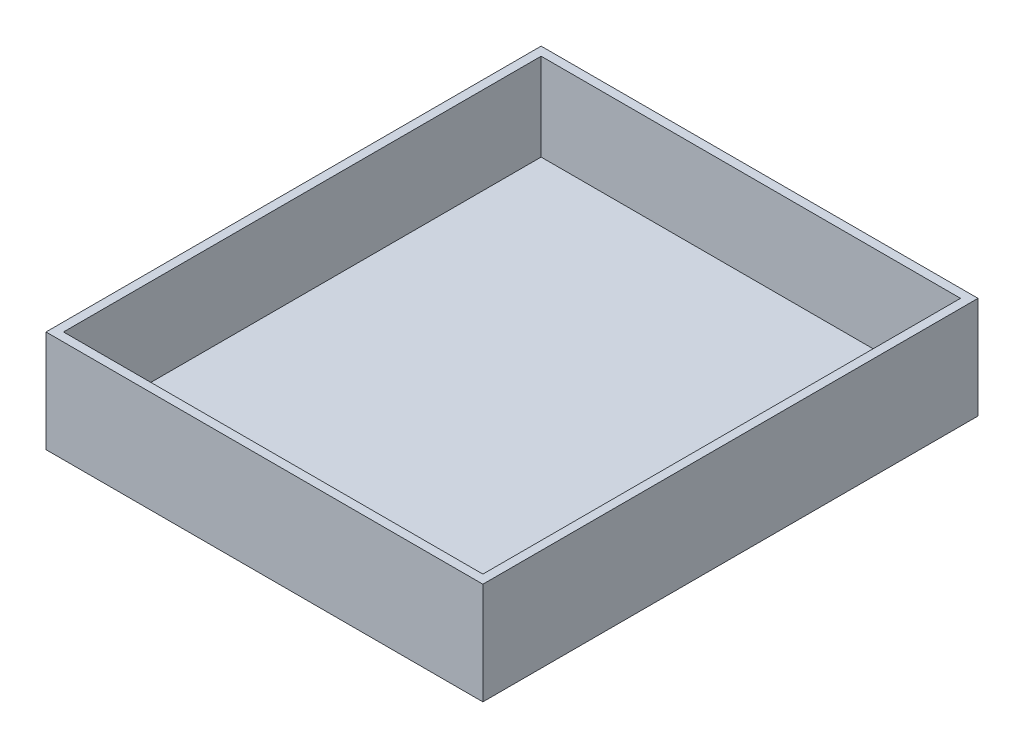
ISO-10303-21;
HEADER;
FILE_DESCRIPTION(('STEP AP214'),'2;1');
FILE_NAME('part.step','',(''),(''),'','','');
FILE_SCHEMA(('AUTOMOTIVE_DESIGN { 1 0 10303 214 1 1 1 1 }'));
ENDSEC;
DATA;
#1=APPLICATION_CONTEXT('core data for automotive mechanical design processes');
#2=APPLICATION_PROTOCOL_DEFINITION('international standard','automotive_design',2000,#1);
#3=PRODUCT_CONTEXT('',#1,'mechanical');
#4=PRODUCT('Part','Part','',(#3));
#5=PRODUCT_RELATED_PRODUCT_CATEGORY('part','',(#4));
#6=PRODUCT_DEFINITION_FORMATION('','',#4);
#7=PRODUCT_DEFINITION_CONTEXT('part definition',#1,'design');
#8=PRODUCT_DEFINITION('design','',#6,#7);
#9=PRODUCT_DEFINITION_SHAPE('','',#8);
#10=(LENGTH_UNIT() NAMED_UNIT(*) SI_UNIT(.MILLI.,.METRE.));
#11=(NAMED_UNIT(*) PLANE_ANGLE_UNIT() SI_UNIT($,.RADIAN.));
#12=(NAMED_UNIT(*) SI_UNIT($,.STERADIAN.) SOLID_ANGLE_UNIT());
#13=UNCERTAINTY_MEASURE_WITH_UNIT(LENGTH_MEASURE(1.E-05),#10,'distance_accuracy_value','');
#14=(GEOMETRIC_REPRESENTATION_CONTEXT(3) GLOBAL_UNCERTAINTY_ASSIGNED_CONTEXT((#13)) GLOBAL_UNIT_ASSIGNED_CONTEXT((#10,
#11,#12)) REPRESENTATION_CONTEXT('',''));
#15=CARTESIAN_POINT('',(0.,0.,0.));
#16=DIRECTION('',(0.,0.,1.));
#17=DIRECTION('',(1.,0.,0.));
#18=AXIS2_PLACEMENT_3D('',#15,#16,#17);
#19=CARTESIAN_POINT('',(75.,5.,85.));
#20=DIRECTION('',(-1.,0.,0.));
#21=DIRECTION('',(0.,0.,1.));
#22=AXIS2_PLACEMENT_3D('',#19,#20,#21);
#23=PLANE('',#22);
#24=DIRECTION('',(0.,0.,-1.));
#25=VECTOR('',#24,1.);
#26=CARTESIAN_POINT('',(75.,0.,85.));
#27=LINE('',#26,#25);
#28=CARTESIAN_POINT('',(75.,0.,85.));
#29=VERTEX_POINT('',#28);
#30=CARTESIAN_POINT('',(75.,0.,-85.));
#31=VERTEX_POINT('',#30);
#32=EDGE_CURVE('E177',#29,#31,#27,.T.);
#33=ORIENTED_EDGE('',*,*,#32,.T.);
#34=DIRECTION('',(0.,-1.,0.));
#35=VECTOR('',#34,1.);
#36=CARTESIAN_POINT('',(75.,5.,-85.));
#37=LINE('',#36,#35);
#38=CARTESIAN_POINT('',(75.,35.,-85.));
#39=VERTEX_POINT('',#38);
#40=EDGE_CURVE('E11',#39,#31,#37,.T.);
#41=ORIENTED_EDGE('',*,*,#40,.F.);
#42=DIRECTION('',(0.,0.,-1.));
#43=VECTOR('',#42,1.);
#44=CARTESIAN_POINT('',(75.,35.,85.));
#45=LINE('',#44,#43);
#46=CARTESIAN_POINT('',(75.,35.,85.));
#47=VERTEX_POINT('',#46);
#48=EDGE_CURVE('E128',#47,#39,#45,.T.);
#49=ORIENTED_EDGE('',*,*,#48,.F.);
#50=DIRECTION('',(0.,-1.,0.));
#51=VECTOR('',#50,1.);
#52=CARTESIAN_POINT('',(75.,5.,85.));
#53=LINE('',#52,#51);
#54=EDGE_CURVE('E189',#47,#29,#53,.T.);
#55=ORIENTED_EDGE('',*,*,#54,.T.);
#56=EDGE_LOOP('',(#33,#41,#49,#55));
#57=FACE_BOUND('',#56,.T.);
#58=ADVANCED_FACE('F43',(#57),#23,.F.);
#59=CARTESIAN_POINT('',(-75.,5.,-85.));
#60=DIRECTION('',(0.,0.,1.));
#61=DIRECTION('',(1.,0.,0.));
#62=AXIS2_PLACEMENT_3D('',#59,#60,#61);
#63=PLANE('',#62);
#64=DIRECTION('',(-1.,0.,0.));
#65=VECTOR('',#64,1.);
#66=CARTESIAN_POINT('',(-75.,0.,-85.));
#67=LINE('',#66,#65);
#68=CARTESIAN_POINT('',(-75.,0.,-85.));
#69=VERTEX_POINT('',#68);
#70=EDGE_CURVE('E181',#31,#69,#67,.T.);
#71=ORIENTED_EDGE('',*,*,#70,.T.);
#72=DIRECTION('',(0.,-1.,0.));
#73=VECTOR('',#72,1.);
#74=CARTESIAN_POINT('',(-75.,5.,-85.));
#75=LINE('',#74,#73);
#76=CARTESIAN_POINT('',(-75.,35.,-85.));
#77=VERTEX_POINT('',#76);
#78=EDGE_CURVE('E51',#77,#69,#75,.T.);
#79=ORIENTED_EDGE('',*,*,#78,.F.);
#80=DIRECTION('',(-1.,0.,0.));
#81=VECTOR('',#80,1.);
#82=CARTESIAN_POINT('',(-75.,35.,-85.));
#83=LINE('',#82,#81);
#84=EDGE_CURVE('E165',#39,#77,#83,.T.);
#85=ORIENTED_EDGE('',*,*,#84,.F.);
#86=ORIENTED_EDGE('',*,*,#40,.T.);
#87=EDGE_LOOP('',(#71,#79,#85,#86));
#88=FACE_BOUND('',#87,.T.);
#89=ADVANCED_FACE('F210',(#88),#63,.F.);
#90=CARTESIAN_POINT('',(-75.,5.,85.));
#91=DIRECTION('',(1.,0.,0.));
#92=DIRECTION('',(0.,0.,-1.));
#93=AXIS2_PLACEMENT_3D('',#90,#91,#92);
#94=PLANE('',#93);
#95=DIRECTION('',(0.,0.,1.));
#96=VECTOR('',#95,1.);
#97=CARTESIAN_POINT('',(-75.,0.,85.));
#98=LINE('',#97,#96);
#99=CARTESIAN_POINT('',(-75.,0.,85.));
#100=VERTEX_POINT('',#99);
#101=EDGE_CURVE('E184',#69,#100,#98,.T.);
#102=ORIENTED_EDGE('',*,*,#101,.T.);
#103=DIRECTION('',(0.,-1.,0.));
#104=VECTOR('',#103,1.);
#105=CARTESIAN_POINT('',(-75.,5.,85.));
#106=LINE('',#105,#104);
#107=CARTESIAN_POINT('',(-75.,35.,85.));
#108=VERTEX_POINT('',#107);
#109=EDGE_CURVE('E192',#108,#100,#106,.T.);
#110=ORIENTED_EDGE('',*,*,#109,.F.);
#111=DIRECTION('',(0.,0.,1.));
#112=VECTOR('',#111,1.);
#113=CARTESIAN_POINT('',(-75.,35.,85.));
#114=LINE('',#113,#112);
#115=EDGE_CURVE('E169',#77,#108,#114,.T.);
#116=ORIENTED_EDGE('',*,*,#115,.F.);
#117=ORIENTED_EDGE('',*,*,#78,.T.);
#118=EDGE_LOOP('',(#102,#110,#116,#117));
#119=FACE_BOUND('',#118,.T.);
#120=ADVANCED_FACE('F199',(#119),#94,.F.);
#121=CARTESIAN_POINT('',(-75.,5.,85.));
#122=DIRECTION('',(0.,0.,-1.));
#123=DIRECTION('',(-1.,0.,0.));
#124=AXIS2_PLACEMENT_3D('',#121,#122,#123);
#125=PLANE('',#124);
#126=DIRECTION('',(1.,0.,0.));
#127=VECTOR('',#126,1.);
#128=CARTESIAN_POINT('',(-75.,0.,85.));
#129=LINE('',#128,#127);
#130=EDGE_CURVE('E66',#100,#29,#129,.T.);
#131=ORIENTED_EDGE('',*,*,#130,.T.);
#132=ORIENTED_EDGE('',*,*,#54,.F.);
#133=DIRECTION('',(1.,0.,0.));
#134=VECTOR('',#133,1.);
#135=CARTESIAN_POINT('',(-75.,35.,85.));
#136=LINE('',#135,#134);
#137=EDGE_CURVE('E173',#108,#47,#136,.T.);
#138=ORIENTED_EDGE('',*,*,#137,.F.);
#139=ORIENTED_EDGE('',*,*,#109,.T.);
#140=EDGE_LOOP('',(#131,#132,#138,#139));
#141=FACE_BOUND('',#140,.T.);
#142=ADVANCED_FACE('F208',(#141),#125,.F.);
#143=CARTESIAN_POINT('',(0.,0.,0.));
#144=DIRECTION('',(0.,-1.,0.));
#145=DIRECTION('',(0.,0.,-1.));
#146=AXIS2_PLACEMENT_3D('',#143,#144,#145);
#147=PLANE('',#146);
#148=ORIENTED_EDGE('',*,*,#32,.F.);
#149=ORIENTED_EDGE('',*,*,#130,.F.);
#150=ORIENTED_EDGE('',*,*,#101,.F.);
#151=ORIENTED_EDGE('',*,*,#70,.F.);
#152=EDGE_LOOP('',(#148,#149,#150,#151));
#153=FACE_BOUND('',#152,.T.);
#154=ADVANCED_FACE('F204',(#153),#147,.T.);
#155=CARTESIAN_POINT('',(0.,35.,0.));
#156=DIRECTION('',(0.,-1.,0.));
#157=DIRECTION('',(0.,0.,-1.));
#158=AXIS2_PLACEMENT_3D('',#155,#156,#157);
#159=PLANE('',#158);
#160=ORIENTED_EDGE('',*,*,#48,.T.);
#161=ORIENTED_EDGE('',*,*,#84,.T.);
#162=ORIENTED_EDGE('',*,*,#115,.T.);
#163=ORIENTED_EDGE('',*,*,#137,.T.);
#164=EDGE_LOOP('',(#160,#161,#162,#163));
#165=FACE_BOUND('',#164,.T.);
#166=DIRECTION('',(1.,0.,0.));
#167=VECTOR('',#166,1.);
#168=CARTESIAN_POINT('',(-72.,35.,82.));
#169=LINE('',#168,#167);
#170=CARTESIAN_POINT('',(-72.,35.,82.));
#171=VERTEX_POINT('',#170);
#172=CARTESIAN_POINT('',(72.,35.,82.));
#173=VERTEX_POINT('',#172);
#174=EDGE_CURVE('E110',#171,#173,#169,.T.);
#175=ORIENTED_EDGE('',*,*,#174,.F.);
#176=DIRECTION('',(0.,0.,1.));
#177=VECTOR('',#176,1.);
#178=CARTESIAN_POINT('',(-72.,35.,82.));
#179=LINE('',#178,#177);
#180=CARTESIAN_POINT('',(-72.,35.,-82.));
#181=VERTEX_POINT('',#180);
#182=EDGE_CURVE('E138',#181,#171,#179,.T.);
#183=ORIENTED_EDGE('',*,*,#182,.F.);
#184=DIRECTION('',(-1.,0.,0.));
#185=VECTOR('',#184,1.);
#186=CARTESIAN_POINT('',(-72.,35.,-82.));
#187=LINE('',#186,#185);
#188=CARTESIAN_POINT('',(72.,35.,-82.));
#189=VERTEX_POINT('',#188);
#190=EDGE_CURVE('E134',#189,#181,#187,.T.);
#191=ORIENTED_EDGE('',*,*,#190,.F.);
#192=DIRECTION('',(0.,0.,-1.));
#193=VECTOR('',#192,1.);
#194=CARTESIAN_POINT('',(72.,35.,82.));
#195=LINE('',#194,#193);
#196=EDGE_CURVE('E119',#173,#189,#195,.T.);
#197=ORIENTED_EDGE('',*,*,#196,.F.);
#198=EDGE_LOOP('',(#175,#183,#191,#197));
#199=FACE_BOUND('',#198,.T.);
#200=ADVANCED_FACE('F132',(#165,#199),#159,.F.);
#201=CARTESIAN_POINT('',(-72.,35.,82.));
#202=DIRECTION('',(0.,0.,-1.));
#203=DIRECTION('',(-1.,0.,0.));
#204=AXIS2_PLACEMENT_3D('',#201,#202,#203);
#205=PLANE('',#204);
#206=DIRECTION('',(1.,0.,0.));
#207=VECTOR('',#206,1.);
#208=CARTESIAN_POINT('',(-72.,5.,82.));
#209=LINE('',#208,#207);
#210=CARTESIAN_POINT('',(-72.,5.,82.));
#211=VERTEX_POINT('',#210);
#212=CARTESIAN_POINT('',(72.,5.,82.));
#213=VERTEX_POINT('',#212);
#214=EDGE_CURVE('E143',#211,#213,#209,.T.);
#215=ORIENTED_EDGE('',*,*,#214,.F.);
#216=DIRECTION('',(0.,-1.,0.));
#217=VECTOR('',#216,1.);
#218=CARTESIAN_POINT('',(-72.,35.,82.));
#219=LINE('',#218,#217);
#220=EDGE_CURVE('E58',#171,#211,#219,.T.);
#221=ORIENTED_EDGE('',*,*,#220,.F.);
#222=ORIENTED_EDGE('',*,*,#174,.T.);
#223=DIRECTION('',(0.,-1.,0.));
#224=VECTOR('',#223,1.);
#225=CARTESIAN_POINT('',(72.,35.,82.));
#226=LINE('',#225,#224);
#227=EDGE_CURVE('E113',#173,#213,#226,.T.);
#228=ORIENTED_EDGE('',*,*,#227,.T.);
#229=EDGE_LOOP('',(#215,#221,#222,#228));
#230=FACE_BOUND('',#229,.T.);
#231=ADVANCED_FACE('F112',(#230),#205,.T.);
#232=CARTESIAN_POINT('',(72.,35.,82.));
#233=DIRECTION('',(-1.,0.,0.));
#234=DIRECTION('',(0.,0.,1.));
#235=AXIS2_PLACEMENT_3D('',#232,#233,#234);
#236=PLANE('',#235);
#237=DIRECTION('',(0.,0.,-1.));
#238=VECTOR('',#237,1.);
#239=CARTESIAN_POINT('',(72.,5.,82.));
#240=LINE('',#239,#238);
#241=CARTESIAN_POINT('',(72.,5.,-82.));
#242=VERTEX_POINT('',#241);
#243=EDGE_CURVE('E126',#213,#242,#240,.T.);
#244=ORIENTED_EDGE('',*,*,#243,.F.);
#245=ORIENTED_EDGE('',*,*,#227,.F.);
#246=ORIENTED_EDGE('',*,*,#196,.T.);
#247=DIRECTION('',(0.,-1.,0.));
#248=VECTOR('',#247,1.);
#249=CARTESIAN_POINT('',(72.,35.,-82.));
#250=LINE('',#249,#248);
#251=EDGE_CURVE('E129',#189,#242,#250,.T.);
#252=ORIENTED_EDGE('',*,*,#251,.T.);
#253=EDGE_LOOP('',(#244,#245,#246,#252));
#254=FACE_BOUND('',#253,.T.);
#255=ADVANCED_FACE('F123',(#254),#236,.T.);
#256=CARTESIAN_POINT('',(-72.,35.,-82.));
#257=DIRECTION('',(0.,0.,1.));
#258=DIRECTION('',(1.,0.,0.));
#259=AXIS2_PLACEMENT_3D('',#256,#257,#258);
#260=PLANE('',#259);
#261=DIRECTION('',(-1.,0.,0.));
#262=VECTOR('',#261,1.);
#263=CARTESIAN_POINT('',(-72.,5.,-82.));
#264=LINE('',#263,#262);
#265=CARTESIAN_POINT('',(-72.,5.,-82.));
#266=VERTEX_POINT('',#265);
#267=EDGE_CURVE('E148',#242,#266,#264,.T.);
#268=ORIENTED_EDGE('',*,*,#267,.F.);
#269=ORIENTED_EDGE('',*,*,#251,.F.);
#270=ORIENTED_EDGE('',*,*,#190,.T.);
#271=DIRECTION('',(0.,-1.,0.));
#272=VECTOR('',#271,1.);
#273=CARTESIAN_POINT('',(-72.,35.,-82.));
#274=LINE('',#273,#272);
#275=EDGE_CURVE('E157',#181,#266,#274,.T.);
#276=ORIENTED_EDGE('',*,*,#275,.T.);
#277=EDGE_LOOP('',(#268,#269,#270,#276));
#278=FACE_BOUND('',#277,.T.);
#279=ADVANCED_FACE('F233',(#278),#260,.T.);
#280=CARTESIAN_POINT('',(-72.,35.,82.));
#281=DIRECTION('',(1.,0.,0.));
#282=DIRECTION('',(0.,0.,-1.));
#283=AXIS2_PLACEMENT_3D('',#280,#281,#282);
#284=PLANE('',#283);
#285=DIRECTION('',(0.,0.,1.));
#286=VECTOR('',#285,1.);
#287=CARTESIAN_POINT('',(-72.,5.,82.));
#288=LINE('',#287,#286);
#289=EDGE_CURVE('E120',#266,#211,#288,.T.);
#290=ORIENTED_EDGE('',*,*,#289,.F.);
#291=ORIENTED_EDGE('',*,*,#275,.F.);
#292=ORIENTED_EDGE('',*,*,#182,.T.);
#293=ORIENTED_EDGE('',*,*,#220,.T.);
#294=EDGE_LOOP('',(#290,#291,#292,#293));
#295=FACE_BOUND('',#294,.T.);
#296=ADVANCED_FACE('F225',(#295),#284,.T.);
#297=CARTESIAN_POINT('',(0.,5.,0.));
#298=DIRECTION('',(0.,-1.,0.));
#299=DIRECTION('',(0.,0.,-1.));
#300=AXIS2_PLACEMENT_3D('',#297,#298,#299);
#301=PLANE('',#300);
#302=ORIENTED_EDGE('',*,*,#289,.T.);
#303=ORIENTED_EDGE('',*,*,#214,.T.);
#304=ORIENTED_EDGE('',*,*,#243,.T.);
#305=ORIENTED_EDGE('',*,*,#267,.T.);
#306=EDGE_LOOP('',(#302,#303,#304,#305));
#307=FACE_BOUND('',#306,.T.);
#308=ADVANCED_FACE('F222',(#307),#301,.F.);
#309=CLOSED_SHELL('',(#58,#89,#120,#142,#154,#200,#231,#255,#279,#296,#308));
#310=MANIFOLD_SOLID_BREP('B2',#309);
#311=ADVANCED_BREP_SHAPE_REPRESENTATION('',(#18,#310),#14);
#312=SHAPE_DEFINITION_REPRESENTATION(#9,#311);
ENDSEC;
END-ISO-10303-21;
